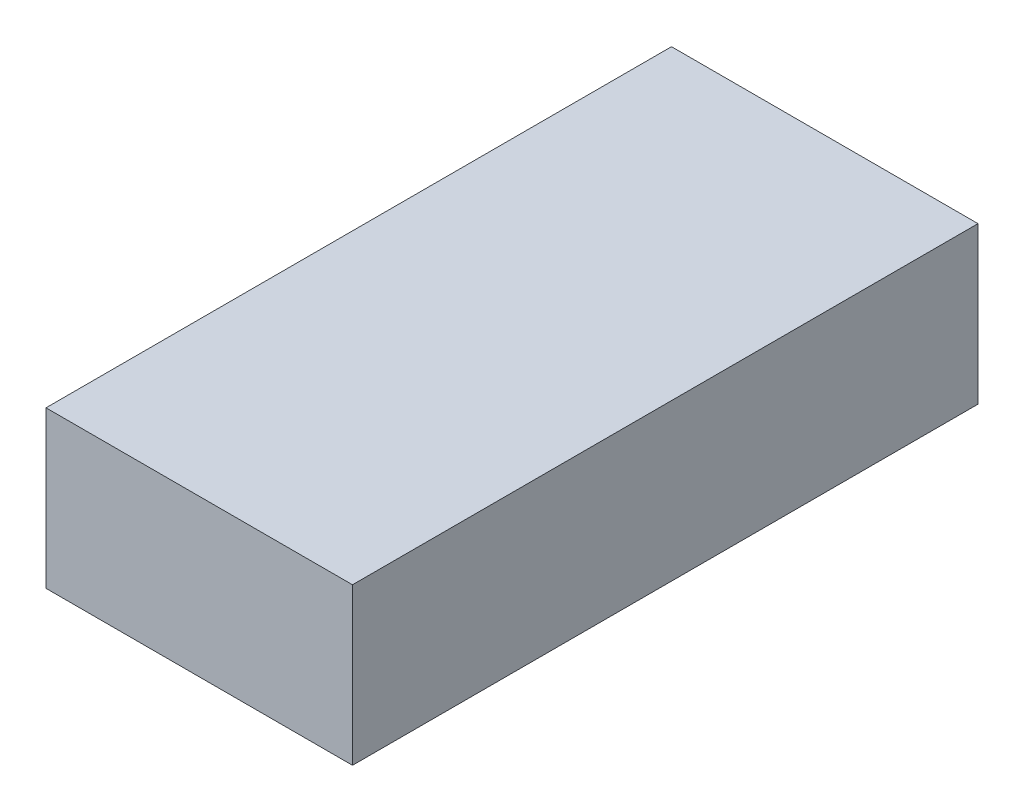
ISO-10303-21;
HEADER;
FILE_DESCRIPTION(('STEP AP214'),'2;1');
FILE_NAME('part.step','',(''),(''),'','','');
FILE_SCHEMA(('AUTOMOTIVE_DESIGN { 1 0 10303 214 1 1 1 1 }'));
ENDSEC;
DATA;
#1=APPLICATION_CONTEXT('core data for automotive mechanical design processes');
#2=APPLICATION_PROTOCOL_DEFINITION('international standard','automotive_design',2000,#1);
#3=PRODUCT_CONTEXT('',#1,'mechanical');
#4=PRODUCT('Part','Part','',(#3));
#5=PRODUCT_RELATED_PRODUCT_CATEGORY('part','',(#4));
#6=PRODUCT_DEFINITION_FORMATION('','',#4);
#7=PRODUCT_DEFINITION_CONTEXT('part definition',#1,'design');
#8=PRODUCT_DEFINITION('design','',#6,#7);
#9=PRODUCT_DEFINITION_SHAPE('','',#8);
#10=(LENGTH_UNIT() NAMED_UNIT(*) SI_UNIT(.MILLI.,.METRE.));
#11=(NAMED_UNIT(*) PLANE_ANGLE_UNIT() SI_UNIT($,.RADIAN.));
#12=(NAMED_UNIT(*) SI_UNIT($,.STERADIAN.) SOLID_ANGLE_UNIT());
#13=UNCERTAINTY_MEASURE_WITH_UNIT(LENGTH_MEASURE(1.E-05),#10,'distance_accuracy_value','');
#14=(GEOMETRIC_REPRESENTATION_CONTEXT(3) GLOBAL_UNCERTAINTY_ASSIGNED_CONTEXT((#13)) GLOBAL_UNIT_ASSIGNED_CONTEXT((#10,
#11,#12)) REPRESENTATION_CONTEXT('',''));
#15=CARTESIAN_POINT('',(0.,0.,0.));
#16=DIRECTION('',(0.,0.,1.));
#17=DIRECTION('',(1.,0.,0.));
#18=AXIS2_PLACEMENT_3D('',#15,#16,#17);
#19=CARTESIAN_POINT('',(49.,25.,100.));
#20=DIRECTION('',(-1.,0.,0.));
#21=DIRECTION('',(0.,0.,1.));
#22=AXIS2_PLACEMENT_3D('',#19,#20,#21);
#23=PLANE('',#22);
#24=DIRECTION('',(0.,1.,0.));
#25=VECTOR('',#24,1.);
#26=CARTESIAN_POINT('',(49.,25.,-100.));
#27=LINE('',#26,#25);
#28=CARTESIAN_POINT('',(49.,-25.,-100.));
#29=VERTEX_POINT('',#28);
#30=CARTESIAN_POINT('',(49.,25.,-100.));
#31=VERTEX_POINT('',#30);
#32=EDGE_CURVE('E133',#29,#31,#27,.T.);
#33=ORIENTED_EDGE('',*,*,#32,.T.);
#34=DIRECTION('',(0.,0.,-1.));
#35=VECTOR('',#34,1.);
#36=CARTESIAN_POINT('',(49.,25.,100.));
#37=LINE('',#36,#35);
#38=CARTESIAN_POINT('',(49.,25.,100.));
#39=VERTEX_POINT('',#38);
#40=EDGE_CURVE('E11',#39,#31,#37,.T.);
#41=ORIENTED_EDGE('',*,*,#40,.F.);
#42=DIRECTION('',(0.,1.,0.));
#43=VECTOR('',#42,1.);
#44=CARTESIAN_POINT('',(49.,25.,100.));
#45=LINE('',#44,#43);
#46=CARTESIAN_POINT('',(49.,-25.,100.));
#47=VERTEX_POINT('',#46);
#48=EDGE_CURVE('E134',#47,#39,#45,.T.);
#49=ORIENTED_EDGE('',*,*,#48,.F.);
#50=DIRECTION('',(0.,0.,-1.));
#51=VECTOR('',#50,1.);
#52=CARTESIAN_POINT('',(49.,-25.,100.));
#53=LINE('',#52,#51);
#54=EDGE_CURVE('E140',#47,#29,#53,.T.);
#55=ORIENTED_EDGE('',*,*,#54,.T.);
#56=EDGE_LOOP('',(#33,#41,#49,#55));
#57=FACE_BOUND('',#56,.T.);
#58=ADVANCED_FACE('F40',(#57),#23,.F.);
#59=CARTESIAN_POINT('',(-49.,25.,100.));
#60=DIRECTION('',(0.,-1.,0.));
#61=DIRECTION('',(0.,0.,-1.));
#62=AXIS2_PLACEMENT_3D('',#59,#60,#61);
#63=PLANE('',#62);
#64=DIRECTION('',(-1.,0.,0.));
#65=VECTOR('',#64,1.);
#66=CARTESIAN_POINT('',(-49.,25.,-100.));
#67=LINE('',#66,#65);
#68=CARTESIAN_POINT('',(-49.,25.,-100.));
#69=VERTEX_POINT('',#68);
#70=EDGE_CURVE('E143',#31,#69,#67,.T.);
#71=ORIENTED_EDGE('',*,*,#70,.T.);
#72=DIRECTION('',(0.,0.,-1.));
#73=VECTOR('',#72,1.);
#74=CARTESIAN_POINT('',(-49.,25.,100.));
#75=LINE('',#74,#73);
#76=CARTESIAN_POINT('',(-49.,25.,100.));
#77=VERTEX_POINT('',#76);
#78=EDGE_CURVE('E48',#77,#69,#75,.T.);
#79=ORIENTED_EDGE('',*,*,#78,.F.);
#80=DIRECTION('',(-1.,0.,0.));
#81=VECTOR('',#80,1.);
#82=CARTESIAN_POINT('',(-49.,25.,100.));
#83=LINE('',#82,#81);
#84=EDGE_CURVE('E87',#39,#77,#83,.T.);
#85=ORIENTED_EDGE('',*,*,#84,.F.);
#86=ORIENTED_EDGE('',*,*,#40,.T.);
#87=EDGE_LOOP('',(#71,#79,#85,#86));
#88=FACE_BOUND('',#87,.T.);
#89=ADVANCED_FACE('F167',(#88),#63,.F.);
#90=CARTESIAN_POINT('',(-49.,25.,100.));
#91=DIRECTION('',(1.,0.,0.));
#92=DIRECTION('',(0.,1.,0.));
#93=AXIS2_PLACEMENT_3D('',#90,#91,#92);
#94=PLANE('',#93);
#95=DIRECTION('',(0.,-1.,0.));
#96=VECTOR('',#95,1.);
#97=CARTESIAN_POINT('',(-49.,25.,-100.));
#98=LINE('',#97,#96);
#99=CARTESIAN_POINT('',(-49.,-25.,-100.));
#100=VERTEX_POINT('',#99);
#101=EDGE_CURVE('E74',#69,#100,#98,.T.);
#102=ORIENTED_EDGE('',*,*,#101,.T.);
#103=DIRECTION('',(0.,0.,-1.));
#104=VECTOR('',#103,1.);
#105=CARTESIAN_POINT('',(-49.,-25.,100.));
#106=LINE('',#105,#104);
#107=CARTESIAN_POINT('',(-49.,-25.,100.));
#108=VERTEX_POINT('',#107);
#109=EDGE_CURVE('E148',#108,#100,#106,.T.);
#110=ORIENTED_EDGE('',*,*,#109,.F.);
#111=DIRECTION('',(0.,-1.,0.));
#112=VECTOR('',#111,1.);
#113=CARTESIAN_POINT('',(-49.,25.,100.));
#114=LINE('',#113,#112);
#115=EDGE_CURVE('E137',#77,#108,#114,.T.);
#116=ORIENTED_EDGE('',*,*,#115,.F.);
#117=ORIENTED_EDGE('',*,*,#78,.T.);
#118=EDGE_LOOP('',(#102,#110,#116,#117));
#119=FACE_BOUND('',#118,.T.);
#120=ADVANCED_FACE('F150',(#119),#94,.F.);
#121=CARTESIAN_POINT('',(-49.,-25.,100.));
#122=DIRECTION('',(0.,1.,0.));
#123=DIRECTION('',(0.,0.,1.));
#124=AXIS2_PLACEMENT_3D('',#121,#122,#123);
#125=PLANE('',#124);
#126=CARTESIAN_POINT('',(-25.,-25.,75.));
#127=DIRECTION('',(0.,-1.,0.));
#128=DIRECTION('',(0.,0.,-1.));
#129=AXIS2_PLACEMENT_3D('',#126,#127,#128);
#130=CIRCLE('',#129,1.64999999999999);
#131=CARTESIAN_POINT('',(-25.,-25.,73.35));
#132=VERTEX_POINT('',#131);
#133=EDGE_CURVE('E111',#132,#132,#130,.T.);
#134=ORIENTED_EDGE('',*,*,#133,.F.);
#135=EDGE_LOOP('',(#134));
#136=FACE_BOUND('',#135,.T.);
#137=CARTESIAN_POINT('',(25.,-25.,75.));
#138=DIRECTION('',(0.,-1.,0.));
#139=DIRECTION('',(0.,0.,-1.));
#140=AXIS2_PLACEMENT_3D('',#137,#138,#139);
#141=CIRCLE('',#140,1.64999999999999);
#142=CARTESIAN_POINT('',(25.,-25.,73.35));
#143=VERTEX_POINT('',#142);
#144=EDGE_CURVE('E110',#143,#143,#141,.T.);
#145=ORIENTED_EDGE('',*,*,#144,.F.);
#146=EDGE_LOOP('',(#145));
#147=FACE_BOUND('',#146,.T.);
#148=CARTESIAN_POINT('',(25.,-25.,-75.));
#149=DIRECTION('',(0.,-1.,0.));
#150=DIRECTION('',(0.,0.,-1.));
#151=AXIS2_PLACEMENT_3D('',#148,#149,#150);
#152=CIRCLE('',#151,1.64999999999999);
#153=CARTESIAN_POINT('',(25.,-25.,-76.65));
#154=VERTEX_POINT('',#153);
#155=EDGE_CURVE('E121',#154,#154,#152,.T.);
#156=ORIENTED_EDGE('',*,*,#155,.F.);
#157=EDGE_LOOP('',(#156));
#158=FACE_BOUND('',#157,.T.);
#159=CARTESIAN_POINT('',(-25.,-25.,-75.));
#160=DIRECTION('',(0.,-1.,0.));
#161=DIRECTION('',(0.,0.,-1.));
#162=AXIS2_PLACEMENT_3D('',#159,#160,#161);
#163=CIRCLE('',#162,1.64999999999999);
#164=CARTESIAN_POINT('',(-25.,-25.,-76.65));
#165=VERTEX_POINT('',#164);
#166=EDGE_CURVE('E127',#165,#165,#163,.T.);
#167=ORIENTED_EDGE('',*,*,#166,.F.);
#168=EDGE_LOOP('',(#167));
#169=FACE_BOUND('',#168,.T.);
#170=DIRECTION('',(1.,0.,0.));
#171=VECTOR('',#170,1.);
#172=CARTESIAN_POINT('',(-49.,-25.,-100.));
#173=LINE('',#172,#171);
#174=EDGE_CURVE('E80',#100,#29,#173,.T.);
#175=ORIENTED_EDGE('',*,*,#174,.T.);
#176=ORIENTED_EDGE('',*,*,#54,.F.);
#177=DIRECTION('',(1.,0.,0.));
#178=VECTOR('',#177,1.);
#179=CARTESIAN_POINT('',(-49.,-25.,100.));
#180=LINE('',#179,#178);
#181=EDGE_CURVE('E56',#108,#47,#180,.T.);
#182=ORIENTED_EDGE('',*,*,#181,.F.);
#183=ORIENTED_EDGE('',*,*,#109,.T.);
#184=EDGE_LOOP('',(#175,#176,#182,#183));
#185=FACE_BOUND('',#184,.T.);
#186=ADVANCED_FACE('F157',(#136,#147,#158,#169,#185),#125,.F.);
#187=CARTESIAN_POINT('',(0.,0.,100.));
#188=DIRECTION('',(0.,0.,1.));
#189=DIRECTION('',(1.,0.,0.));
#190=AXIS2_PLACEMENT_3D('',#187,#188,#189);
#191=PLANE('',#190);
#192=ORIENTED_EDGE('',*,*,#48,.T.);
#193=ORIENTED_EDGE('',*,*,#84,.T.);
#194=ORIENTED_EDGE('',*,*,#115,.T.);
#195=ORIENTED_EDGE('',*,*,#181,.T.);
#196=EDGE_LOOP('',(#192,#193,#194,#195));
#197=FACE_BOUND('',#196,.T.);
#198=ADVANCED_FACE('F159',(#197),#191,.T.);
#199=CARTESIAN_POINT('',(0.,0.,-100.));
#200=DIRECTION('',(0.,0.,1.));
#201=DIRECTION('',(1.,0.,0.));
#202=AXIS2_PLACEMENT_3D('',#199,#200,#201);
#203=PLANE('',#202);
#204=ORIENTED_EDGE('',*,*,#32,.F.);
#205=ORIENTED_EDGE('',*,*,#174,.F.);
#206=ORIENTED_EDGE('',*,*,#101,.F.);
#207=ORIENTED_EDGE('',*,*,#70,.F.);
#208=EDGE_LOOP('',(#204,#205,#206,#207));
#209=FACE_BOUND('',#208,.T.);
#210=ADVANCED_FACE('F153',(#209),#203,.F.);
#211=CARTESIAN_POINT('',(-25.,-13.5,-75.));
#212=DIRECTION('',(0.,-1.,0.));
#213=DIRECTION('',(0.,0.,-1.));
#214=AXIS2_PLACEMENT_3D('',#211,#212,#213);
#215=CONICAL_SURFACE('',#214,1.64999999999999,1.02974425867665);
#216=CARTESIAN_POINT('',(-25.,-12.5085799786045,-75.));
#217=VERTEX_POINT('',#216);
#218=VERTEX_LOOP('',#217);
#219=FACE_BOUND('',#218,.T.);
#220=CARTESIAN_POINT('',(-25.,-13.5,-75.));
#221=DIRECTION('',(0.,-1.,0.));
#222=DIRECTION('',(0.,0.,-1.));
#223=AXIS2_PLACEMENT_3D('',#220,#221,#222);
#224=CIRCLE('',#223,1.64999999999999);
#225=CARTESIAN_POINT('',(-25.,-13.5,-76.65));
#226=VERTEX_POINT('',#225);
#227=EDGE_CURVE('E130',#226,#226,#224,.T.);
#228=ORIENTED_EDGE('',*,*,#227,.T.);
#229=EDGE_LOOP('',(#228));
#230=FACE_BOUND('',#229,.T.);
#231=ADVANCED_FACE('F197',(#219,#230),#215,.F.);
#232=CARTESIAN_POINT('',(-25.,-25.,-75.));
#233=DIRECTION('',(0.,-1.,0.));
#234=DIRECTION('',(0.,0.,-1.));
#235=AXIS2_PLACEMENT_3D('',#232,#233,#234);
#236=CYLINDRICAL_SURFACE('',#235,1.64999999999999);
#237=ORIENTED_EDGE('',*,*,#227,.F.);
#238=EDGE_LOOP('',(#237));
#239=FACE_BOUND('',#238,.T.);
#240=ORIENTED_EDGE('',*,*,#166,.T.);
#241=EDGE_LOOP('',(#240));
#242=FACE_BOUND('',#241,.T.);
#243=ADVANCED_FACE('F209',(#239,#242),#236,.F.);
#244=CARTESIAN_POINT('',(25.,-13.5,-75.));
#245=DIRECTION('',(0.,-1.,0.));
#246=DIRECTION('',(0.,0.,-1.));
#247=AXIS2_PLACEMENT_3D('',#244,#245,#246);
#248=CONICAL_SURFACE('',#247,1.64999999999999,1.02974425867665);
#249=CARTESIAN_POINT('',(25.,-12.5085799786045,-75.));
#250=VERTEX_POINT('',#249);
#251=VERTEX_LOOP('',#250);
#252=FACE_BOUND('',#251,.T.);
#253=CARTESIAN_POINT('',(25.,-13.5,-75.));
#254=DIRECTION('',(0.,-1.,0.));
#255=DIRECTION('',(0.,0.,-1.));
#256=AXIS2_PLACEMENT_3D('',#253,#254,#255);
#257=CIRCLE('',#256,1.64999999999999);
#258=CARTESIAN_POINT('',(25.,-13.5,-76.65));
#259=VERTEX_POINT('',#258);
#260=EDGE_CURVE('E124',#259,#259,#257,.T.);
#261=ORIENTED_EDGE('',*,*,#260,.T.);
#262=EDGE_LOOP('',(#261));
#263=FACE_BOUND('',#262,.T.);
#264=ADVANCED_FACE('F220',(#252,#263),#248,.F.);
#265=CARTESIAN_POINT('',(25.,-25.,-75.));
#266=DIRECTION('',(0.,-1.,0.));
#267=DIRECTION('',(0.,0.,-1.));
#268=AXIS2_PLACEMENT_3D('',#265,#266,#267);
#269=CYLINDRICAL_SURFACE('',#268,1.64999999999999);
#270=ORIENTED_EDGE('',*,*,#260,.F.);
#271=EDGE_LOOP('',(#270));
#272=FACE_BOUND('',#271,.T.);
#273=ORIENTED_EDGE('',*,*,#155,.T.);
#274=EDGE_LOOP('',(#273));
#275=FACE_BOUND('',#274,.T.);
#276=ADVANCED_FACE('F232',(#272,#275),#269,.F.);
#277=CARTESIAN_POINT('',(25.,-13.5,75.));
#278=DIRECTION('',(0.,-1.,0.));
#279=DIRECTION('',(0.,0.,-1.));
#280=AXIS2_PLACEMENT_3D('',#277,#278,#279);
#281=CONICAL_SURFACE('',#280,1.64999999999999,1.02974425867665);
#282=CARTESIAN_POINT('',(25.,-12.5085799786045,75.));
#283=VERTEX_POINT('',#282);
#284=VERTEX_LOOP('',#283);
#285=FACE_BOUND('',#284,.T.);
#286=CARTESIAN_POINT('',(25.,-13.5,75.));
#287=DIRECTION('',(0.,-1.,0.));
#288=DIRECTION('',(0.,0.,-1.));
#289=AXIS2_PLACEMENT_3D('',#286,#287,#288);
#290=CIRCLE('',#289,1.64999999999999);
#291=CARTESIAN_POINT('',(25.,-13.5,73.35));
#292=VERTEX_POINT('',#291);
#293=EDGE_CURVE('E114',#292,#292,#290,.T.);
#294=ORIENTED_EDGE('',*,*,#293,.T.);
#295=EDGE_LOOP('',(#294));
#296=FACE_BOUND('',#295,.T.);
#297=ADVANCED_FACE('F242',(#285,#296),#281,.F.);
#298=CARTESIAN_POINT('',(25.,-25.,75.));
#299=DIRECTION('',(0.,-1.,0.));
#300=DIRECTION('',(0.,0.,-1.));
#301=AXIS2_PLACEMENT_3D('',#298,#299,#300);
#302=CYLINDRICAL_SURFACE('',#301,1.64999999999999);
#303=ORIENTED_EDGE('',*,*,#293,.F.);
#304=EDGE_LOOP('',(#303));
#305=FACE_BOUND('',#304,.T.);
#306=ORIENTED_EDGE('',*,*,#144,.T.);
#307=EDGE_LOOP('',(#306));
#308=FACE_BOUND('',#307,.T.);
#309=ADVANCED_FACE('F104',(#305,#308),#302,.F.);
#310=CARTESIAN_POINT('',(-25.,-13.5,75.));
#311=DIRECTION('',(0.,-1.,0.));
#312=DIRECTION('',(0.,0.,-1.));
#313=AXIS2_PLACEMENT_3D('',#310,#311,#312);
#314=CONICAL_SURFACE('',#313,1.64999999999999,1.02974425867665);
#315=CARTESIAN_POINT('',(-25.,-12.5085799786045,75.));
#316=VERTEX_POINT('',#315);
#317=VERTEX_LOOP('',#316);
#318=FACE_BOUND('',#317,.T.);
#319=CARTESIAN_POINT('',(-25.,-13.5,75.));
#320=DIRECTION('',(0.,-1.,0.));
#321=DIRECTION('',(0.,0.,-1.));
#322=AXIS2_PLACEMENT_3D('',#319,#320,#321);
#323=CIRCLE('',#322,1.64999999999999);
#324=CARTESIAN_POINT('',(-25.,-13.5,73.35));
#325=VERTEX_POINT('',#324);
#326=EDGE_CURVE('E108',#325,#325,#323,.T.);
#327=ORIENTED_EDGE('',*,*,#326,.T.);
#328=EDGE_LOOP('',(#327));
#329=FACE_BOUND('',#328,.T.);
#330=ADVANCED_FACE('F100',(#318,#329),#314,.F.);
#331=CARTESIAN_POINT('',(-25.,-25.,75.));
#332=DIRECTION('',(0.,-1.,0.));
#333=DIRECTION('',(0.,0.,-1.));
#334=AXIS2_PLACEMENT_3D('',#331,#332,#333);
#335=CYLINDRICAL_SURFACE('',#334,1.64999999999999);
#336=ORIENTED_EDGE('',*,*,#326,.F.);
#337=EDGE_LOOP('',(#336));
#338=FACE_BOUND('',#337,.T.);
#339=ORIENTED_EDGE('',*,*,#133,.T.);
#340=EDGE_LOOP('',(#339));
#341=FACE_BOUND('',#340,.T.);
#342=ADVANCED_FACE('F103',(#338,#341),#335,.F.);
#343=CLOSED_SHELL('',(#58,#89,#120,#186,#198,#210,#231,#243,#264,#276,#297,#309,#330,#342));
#344=MANIFOLD_SOLID_BREP('B2',#343);
#345=ADVANCED_BREP_SHAPE_REPRESENTATION('',(#18,#344),#14);
#346=SHAPE_DEFINITION_REPRESENTATION(#9,#345);
ENDSEC;
END-ISO-10303-21;
